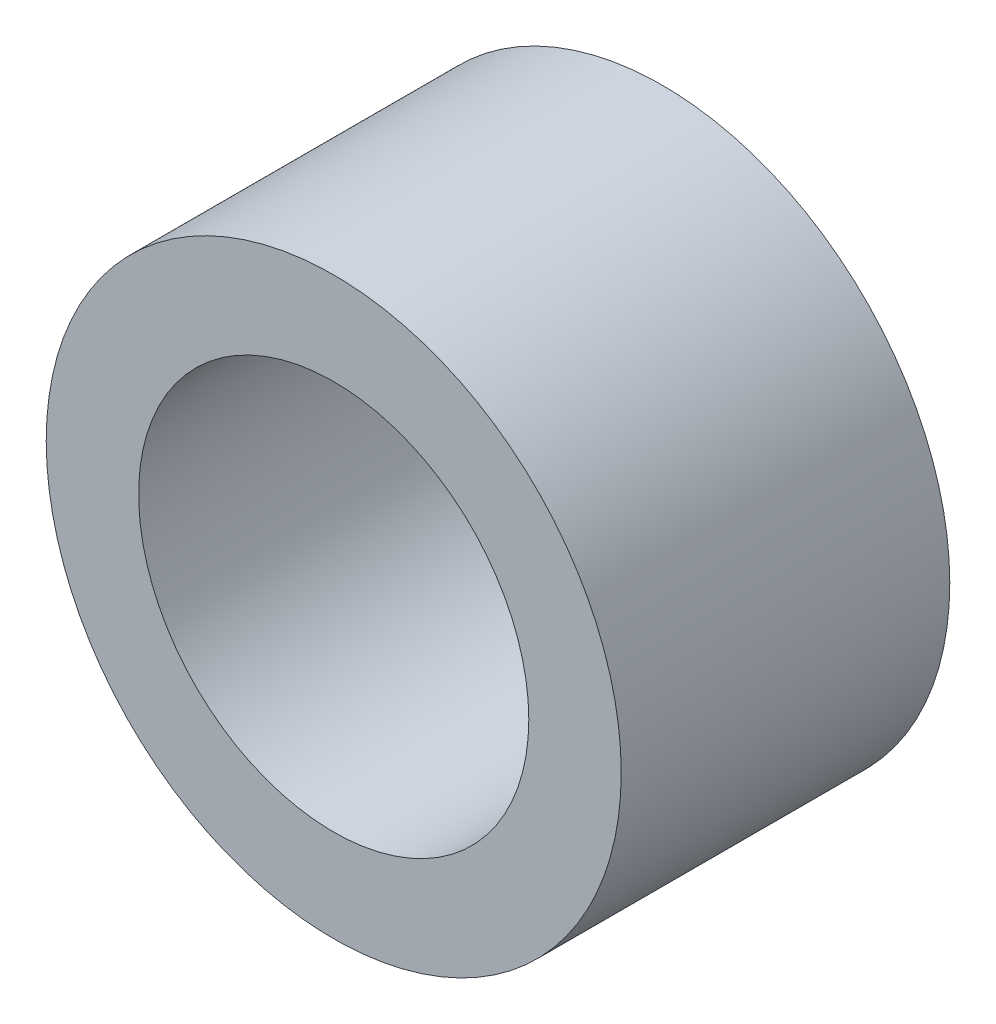
ISO-10303-21;
HEADER;
FILE_DESCRIPTION(('STEP AP214'),'2;1');
FILE_NAME('part.step','',(''),(''),'','','');
FILE_SCHEMA(('AUTOMOTIVE_DESIGN { 1 0 10303 214 1 1 1 1 }'));
ENDSEC;
DATA;
#1=APPLICATION_CONTEXT('core data for automotive mechanical design processes');
#2=APPLICATION_PROTOCOL_DEFINITION('international standard','automotive_design',2000,#1);
#3=PRODUCT_CONTEXT('',#1,'mechanical');
#4=PRODUCT('Part','Part','',(#3));
#5=PRODUCT_RELATED_PRODUCT_CATEGORY('part','',(#4));
#6=PRODUCT_DEFINITION_FORMATION('','',#4);
#7=PRODUCT_DEFINITION_CONTEXT('part definition',#1,'design');
#8=PRODUCT_DEFINITION('design','',#6,#7);
#9=PRODUCT_DEFINITION_SHAPE('','',#8);
#10=(LENGTH_UNIT() NAMED_UNIT(*) SI_UNIT(.MILLI.,.METRE.));
#11=(NAMED_UNIT(*) PLANE_ANGLE_UNIT() SI_UNIT($,.RADIAN.));
#12=(NAMED_UNIT(*) SI_UNIT($,.STERADIAN.) SOLID_ANGLE_UNIT());
#13=UNCERTAINTY_MEASURE_WITH_UNIT(LENGTH_MEASURE(1.E-05),#10,'distance_accuracy_value','');
#14=(GEOMETRIC_REPRESENTATION_CONTEXT(3) GLOBAL_UNCERTAINTY_ASSIGNED_CONTEXT((#13)) GLOBAL_UNIT_ASSIGNED_CONTEXT((#10,
#11,#12)) REPRESENTATION_CONTEXT('',''));
#15=CARTESIAN_POINT('',(0.,0.,0.));
#16=DIRECTION('',(0.,0.,1.));
#17=DIRECTION('',(1.,0.,0.));
#18=AXIS2_PLACEMENT_3D('',#15,#16,#17);
#19=CARTESIAN_POINT('',(0.,23.,0.));
#20=DIRECTION('',(0.,0.,-1.));
#21=DIRECTION('',(-1.,0.,0.));
#22=AXIS2_PLACEMENT_3D('',#19,#20,#21);
#23=PLANE('',#22);
#24=CARTESIAN_POINT('',(0.,9.,0.));
#25=DIRECTION('',(0.,0.,1.));
#26=DIRECTION('',(1.,0.,0.));
#27=AXIS2_PLACEMENT_3D('',#24,#25,#26);
#28=CIRCLE('',#27,9.5);
#29=CARTESIAN_POINT('',(9.5,9.,0.));
#30=VERTEX_POINT('',#29);
#31=EDGE_CURVE('E10',#30,#30,#28,.T.);
#32=ORIENTED_EDGE('',*,*,#31,.T.);
#33=EDGE_LOOP('',(#32));
#34=FACE_BOUND('',#33,.T.);
#35=CARTESIAN_POINT('',(0.,9.,0.));
#36=DIRECTION('',(0.,0.,1.));
#37=DIRECTION('',(1.,0.,0.));
#38=AXIS2_PLACEMENT_3D('',#35,#36,#37);
#39=CIRCLE('',#38,14.);
#40=CARTESIAN_POINT('',(14.,9.,0.));
#41=VERTEX_POINT('',#40);
#42=EDGE_CURVE('E49',#41,#41,#39,.T.);
#43=ORIENTED_EDGE('',*,*,#42,.F.);
#44=EDGE_LOOP('',(#43));
#45=FACE_BOUND('',#44,.T.);
#46=ADVANCED_FACE('F35',(#34,#45),#23,.T.);
#47=CARTESIAN_POINT('',(0.,9.,28.3903353903804));
#48=DIRECTION('',(0.,0.,1.));
#49=DIRECTION('',(1.,0.,0.));
#50=AXIS2_PLACEMENT_3D('',#47,#48,#49);
#51=CYLINDRICAL_SURFACE('',#50,9.5);
#52=CARTESIAN_POINT('',(0.,9.,16.));
#53=DIRECTION('',(0.,0.,1.));
#54=DIRECTION('',(1.,0.,0.));
#55=AXIS2_PLACEMENT_3D('',#52,#53,#54);
#56=CIRCLE('',#55,9.49999999999999);
#57=CARTESIAN_POINT('',(9.49999999999999,9.,16.));
#58=VERTEX_POINT('',#57);
#59=EDGE_CURVE('E41',#58,#58,#56,.T.);
#60=ORIENTED_EDGE('',*,*,#59,.T.);
#61=EDGE_LOOP('',(#60));
#62=FACE_BOUND('',#61,.T.);
#63=ORIENTED_EDGE('',*,*,#31,.F.);
#64=EDGE_LOOP('',(#63));
#65=FACE_BOUND('',#64,.T.);
#66=ADVANCED_FACE('F59',(#62,#65),#51,.F.);
#67=CARTESIAN_POINT('',(0.,18.5,16.));
#68=DIRECTION('',(0.,0.,1.));
#69=DIRECTION('',(1.,0.,0.));
#70=AXIS2_PLACEMENT_3D('',#67,#68,#69);
#71=PLANE('',#70);
#72=CARTESIAN_POINT('',(0.,9.,16.));
#73=DIRECTION('',(0.,0.,1.));
#74=DIRECTION('',(1.,0.,0.));
#75=AXIS2_PLACEMENT_3D('',#72,#73,#74);
#76=CIRCLE('',#75,14.);
#77=CARTESIAN_POINT('',(14.,9.,16.));
#78=VERTEX_POINT('',#77);
#79=EDGE_CURVE('E45',#78,#78,#76,.T.);
#80=ORIENTED_EDGE('',*,*,#79,.T.);
#81=EDGE_LOOP('',(#80));
#82=FACE_BOUND('',#81,.T.);
#83=ORIENTED_EDGE('',*,*,#59,.F.);
#84=EDGE_LOOP('',(#83));
#85=FACE_BOUND('',#84,.T.);
#86=ADVANCED_FACE('F63',(#82,#85),#71,.T.);
#87=CARTESIAN_POINT('',(0.,9.,28.3903353903804));
#88=DIRECTION('',(0.,0.,1.));
#89=DIRECTION('',(1.,0.,0.));
#90=AXIS2_PLACEMENT_3D('',#87,#88,#89);
#91=CYLINDRICAL_SURFACE('',#90,14.);
#92=ORIENTED_EDGE('',*,*,#42,.T.);
#93=EDGE_LOOP('',(#92));
#94=FACE_BOUND('',#93,.T.);
#95=ORIENTED_EDGE('',*,*,#79,.F.);
#96=EDGE_LOOP('',(#95));
#97=FACE_BOUND('',#96,.T.);
#98=ADVANCED_FACE('F55',(#94,#97),#91,.T.);
#99=CLOSED_SHELL('',(#46,#66,#86,#98));
#100=MANIFOLD_SOLID_BREP('B2',#99);
#101=ADVANCED_BREP_SHAPE_REPRESENTATION('',(#18,#100),#14);
#102=SHAPE_DEFINITION_REPRESENTATION(#9,#101);
ENDSEC;
END-ISO-10303-21;
